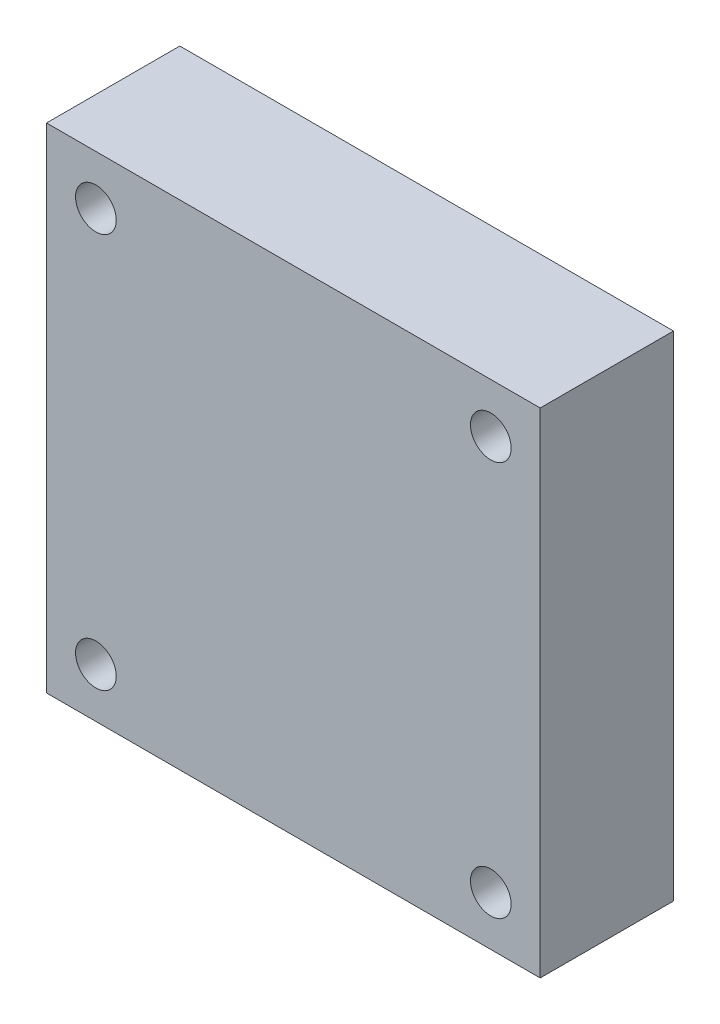
ISO-10303-21;
HEADER;
FILE_DESCRIPTION(('STEP AP214'),'2;1');
FILE_NAME('part.step','',(''),(''),'','','');
FILE_SCHEMA(('AUTOMOTIVE_DESIGN { 1 0 10303 214 1 1 1 1 }'));
ENDSEC;
DATA;
#1=APPLICATION_CONTEXT('core data for automotive mechanical design processes');
#2=APPLICATION_PROTOCOL_DEFINITION('international standard','automotive_design',2000,#1);
#3=PRODUCT_CONTEXT('',#1,'mechanical');
#4=PRODUCT('Part','Part','',(#3));
#5=PRODUCT_RELATED_PRODUCT_CATEGORY('part','',(#4));
#6=PRODUCT_DEFINITION_FORMATION('','',#4);
#7=PRODUCT_DEFINITION_CONTEXT('part definition',#1,'design');
#8=PRODUCT_DEFINITION('design','',#6,#7);
#9=PRODUCT_DEFINITION_SHAPE('','',#8);
#10=(LENGTH_UNIT() NAMED_UNIT(*) SI_UNIT(.MILLI.,.METRE.));
#11=(NAMED_UNIT(*) PLANE_ANGLE_UNIT() SI_UNIT($,.RADIAN.));
#12=(NAMED_UNIT(*) SI_UNIT($,.STERADIAN.) SOLID_ANGLE_UNIT());
#13=UNCERTAINTY_MEASURE_WITH_UNIT(LENGTH_MEASURE(1.E-05),#10,'distance_accuracy_value','');
#14=(GEOMETRIC_REPRESENTATION_CONTEXT(3) GLOBAL_UNCERTAINTY_ASSIGNED_CONTEXT((#13)) GLOBAL_UNIT_ASSIGNED_CONTEXT((#10,
#11,#12)) REPRESENTATION_CONTEXT('',''));
#15=CARTESIAN_POINT('',(0.,0.,0.));
#16=DIRECTION('',(0.,0.,1.));
#17=DIRECTION('',(1.,0.,0.));
#18=AXIS2_PLACEMENT_3D('',#15,#16,#17);
#19=CARTESIAN_POINT('',(0.,0.,10.8));
#20=DIRECTION('',(1.,0.,0.));
#21=DIRECTION('',(0.,0.,-1.));
#22=AXIS2_PLACEMENT_3D('',#19,#20,#21);
#23=PLANE('',#22);
#24=DIRECTION('',(0.,-1.,0.));
#25=VECTOR('',#24,1.);
#26=CARTESIAN_POINT('',(0.,0.,0.));
#27=LINE('',#26,#25);
#28=CARTESIAN_POINT('',(0.,40.,0.));
#29=VERTEX_POINT('',#28);
#30=CARTESIAN_POINT('',(0.,0.,0.));
#31=VERTEX_POINT('',#30);
#32=EDGE_CURVE('E107',#29,#31,#27,.T.);
#33=ORIENTED_EDGE('',*,*,#32,.T.);
#34=DIRECTION('',(0.,0.,-1.));
#35=VECTOR('',#34,1.);
#36=CARTESIAN_POINT('',(0.,0.,10.8));
#37=LINE('',#36,#35);
#38=CARTESIAN_POINT('',(0.,0.,10.8));
#39=VERTEX_POINT('',#38);
#40=EDGE_CURVE('E11',#39,#31,#37,.T.);
#41=ORIENTED_EDGE('',*,*,#40,.F.);
#42=DIRECTION('',(0.,-1.,0.));
#43=VECTOR('',#42,1.);
#44=CARTESIAN_POINT('',(0.,0.,10.8));
#45=LINE('',#44,#43);
#46=CARTESIAN_POINT('',(0.,40.,10.8));
#47=VERTEX_POINT('',#46);
#48=EDGE_CURVE('E91',#47,#39,#45,.T.);
#49=ORIENTED_EDGE('',*,*,#48,.F.);
#50=DIRECTION('',(0.,0.,-1.));
#51=VECTOR('',#50,1.);
#52=CARTESIAN_POINT('',(0.,40.,10.8));
#53=LINE('',#52,#51);
#54=EDGE_CURVE('E103',#47,#29,#53,.T.);
#55=ORIENTED_EDGE('',*,*,#54,.T.);
#56=EDGE_LOOP('',(#33,#41,#49,#55));
#57=FACE_BOUND('',#56,.T.);
#58=ADVANCED_FACE('F39',(#57),#23,.F.);
#59=CARTESIAN_POINT('',(0.,0.,10.8));
#60=DIRECTION('',(0.,1.,0.));
#61=DIRECTION('',(0.,0.,1.));
#62=AXIS2_PLACEMENT_3D('',#59,#60,#61);
#63=PLANE('',#62);
#64=DIRECTION('',(1.,0.,0.));
#65=VECTOR('',#64,1.);
#66=CARTESIAN_POINT('',(0.,0.,0.));
#67=LINE('',#66,#65);
#68=CARTESIAN_POINT('',(40.,0.,0.));
#69=VERTEX_POINT('',#68);
#70=EDGE_CURVE('E96',#31,#69,#67,.T.);
#71=ORIENTED_EDGE('',*,*,#70,.T.);
#72=DIRECTION('',(0.,0.,-1.));
#73=VECTOR('',#72,1.);
#74=CARTESIAN_POINT('',(40.,0.,10.8));
#75=LINE('',#74,#73);
#76=CARTESIAN_POINT('',(40.,0.,10.8));
#77=VERTEX_POINT('',#76);
#78=EDGE_CURVE('E48',#77,#69,#75,.T.);
#79=ORIENTED_EDGE('',*,*,#78,.F.);
#80=DIRECTION('',(1.,0.,0.));
#81=VECTOR('',#80,1.);
#82=CARTESIAN_POINT('',(0.,0.,10.8));
#83=LINE('',#82,#81);
#84=EDGE_CURVE('E86',#39,#77,#83,.T.);
#85=ORIENTED_EDGE('',*,*,#84,.F.);
#86=ORIENTED_EDGE('',*,*,#40,.T.);
#87=EDGE_LOOP('',(#71,#79,#85,#86));
#88=FACE_BOUND('',#87,.T.);
#89=ADVANCED_FACE('F95',(#88),#63,.F.);
#90=CARTESIAN_POINT('',(40.,0.,10.8));
#91=DIRECTION('',(-1.,0.,0.));
#92=DIRECTION('',(0.,0.,1.));
#93=AXIS2_PLACEMENT_3D('',#90,#91,#92);
#94=PLANE('',#93);
#95=DIRECTION('',(0.,1.,0.));
#96=VECTOR('',#95,1.);
#97=CARTESIAN_POINT('',(40.,0.,0.));
#98=LINE('',#97,#96);
#99=CARTESIAN_POINT('',(40.,40.,0.));
#100=VERTEX_POINT('',#99);
#101=EDGE_CURVE('E73',#69,#100,#98,.T.);
#102=ORIENTED_EDGE('',*,*,#101,.T.);
#103=DIRECTION('',(0.,0.,-1.));
#104=VECTOR('',#103,1.);
#105=CARTESIAN_POINT('',(40.,40.,10.8));
#106=LINE('',#105,#104);
#107=CARTESIAN_POINT('',(40.,40.,10.8));
#108=VERTEX_POINT('',#107);
#109=EDGE_CURVE('E98',#108,#100,#106,.T.);
#110=ORIENTED_EDGE('',*,*,#109,.F.);
#111=DIRECTION('',(0.,1.,0.));
#112=VECTOR('',#111,1.);
#113=CARTESIAN_POINT('',(40.,0.,10.8));
#114=LINE('',#113,#112);
#115=EDGE_CURVE('E89',#77,#108,#114,.T.);
#116=ORIENTED_EDGE('',*,*,#115,.F.);
#117=ORIENTED_EDGE('',*,*,#78,.T.);
#118=EDGE_LOOP('',(#102,#110,#116,#117));
#119=FACE_BOUND('',#118,.T.);
#120=ADVANCED_FACE('F99',(#119),#94,.F.);
#121=CARTESIAN_POINT('',(0.,40.,10.8));
#122=DIRECTION('',(0.,-1.,0.));
#123=DIRECTION('',(0.,0.,-1.));
#124=AXIS2_PLACEMENT_3D('',#121,#122,#123);
#125=PLANE('',#124);
#126=DIRECTION('',(-1.,0.,0.));
#127=VECTOR('',#126,1.);
#128=CARTESIAN_POINT('',(0.,40.,0.));
#129=LINE('',#128,#127);
#130=EDGE_CURVE('E79',#100,#29,#129,.T.);
#131=ORIENTED_EDGE('',*,*,#130,.T.);
#132=ORIENTED_EDGE('',*,*,#54,.F.);
#133=DIRECTION('',(-1.,0.,0.));
#134=VECTOR('',#133,1.);
#135=CARTESIAN_POINT('',(0.,40.,10.8));
#136=LINE('',#135,#134);
#137=EDGE_CURVE('E56',#108,#47,#136,.T.);
#138=ORIENTED_EDGE('',*,*,#137,.F.);
#139=ORIENTED_EDGE('',*,*,#109,.T.);
#140=EDGE_LOOP('',(#131,#132,#138,#139));
#141=FACE_BOUND('',#140,.T.);
#142=ADVANCED_FACE('F121',(#141),#125,.F.);
#143=CARTESIAN_POINT('',(0.,0.,10.8));
#144=DIRECTION('',(0.,0.,-1.));
#145=DIRECTION('',(-1.,0.,0.));
#146=AXIS2_PLACEMENT_3D('',#143,#144,#145);
#147=PLANE('',#146);
#148=CARTESIAN_POINT('',(36.,36.,10.8));
#149=DIRECTION('',(0.,0.,1.));
#150=DIRECTION('',(1.,0.,0.));
#151=AXIS2_PLACEMENT_3D('',#148,#149,#150);
#152=CIRCLE('',#151,1.65);
#153=CARTESIAN_POINT('',(37.65,36.,10.8));
#154=VERTEX_POINT('',#153);
#155=EDGE_CURVE('E145',#154,#154,#152,.T.);
#156=ORIENTED_EDGE('',*,*,#155,.F.);
#157=EDGE_LOOP('',(#156));
#158=FACE_BOUND('',#157,.T.);
#159=CARTESIAN_POINT('',(4.,4.00000000000001,10.8));
#160=DIRECTION('',(0.,0.,1.));
#161=DIRECTION('',(1.,0.,0.));
#162=AXIS2_PLACEMENT_3D('',#159,#160,#161);
#163=CIRCLE('',#162,1.65);
#164=CARTESIAN_POINT('',(5.65,4.00000000000001,10.8));
#165=VERTEX_POINT('',#164);
#166=EDGE_CURVE('E136',#165,#165,#163,.T.);
#167=ORIENTED_EDGE('',*,*,#166,.F.);
#168=EDGE_LOOP('',(#167));
#169=FACE_BOUND('',#168,.T.);
#170=CARTESIAN_POINT('',(36.,4.,10.8));
#171=DIRECTION('',(0.,0.,1.));
#172=DIRECTION('',(1.,0.,0.));
#173=AXIS2_PLACEMENT_3D('',#170,#171,#172);
#174=CIRCLE('',#173,1.65);
#175=CARTESIAN_POINT('',(37.65,4.,10.8));
#176=VERTEX_POINT('',#175);
#177=EDGE_CURVE('E152',#176,#176,#174,.T.);
#178=ORIENTED_EDGE('',*,*,#177,.F.);
#179=EDGE_LOOP('',(#178));
#180=FACE_BOUND('',#179,.T.);
#181=CARTESIAN_POINT('',(4.,36.,10.8));
#182=DIRECTION('',(0.,0.,1.));
#183=DIRECTION('',(1.,0.,0.));
#184=AXIS2_PLACEMENT_3D('',#181,#182,#183);
#185=CIRCLE('',#184,1.65);
#186=CARTESIAN_POINT('',(5.65,36.,10.8));
#187=VERTEX_POINT('',#186);
#188=EDGE_CURVE('E128',#187,#187,#185,.T.);
#189=ORIENTED_EDGE('',*,*,#188,.F.);
#190=EDGE_LOOP('',(#189));
#191=FACE_BOUND('',#190,.T.);
#192=ORIENTED_EDGE('',*,*,#48,.T.);
#193=ORIENTED_EDGE('',*,*,#84,.T.);
#194=ORIENTED_EDGE('',*,*,#115,.T.);
#195=ORIENTED_EDGE('',*,*,#137,.T.);
#196=EDGE_LOOP('',(#192,#193,#194,#195));
#197=FACE_BOUND('',#196,.T.);
#198=ADVANCED_FACE('F87',(#158,#169,#180,#191,#197),#147,.F.);
#199=CARTESIAN_POINT('',(0.,0.,0.));
#200=DIRECTION('',(0.,0.,-1.));
#201=DIRECTION('',(-1.,0.,0.));
#202=AXIS2_PLACEMENT_3D('',#199,#200,#201);
#203=PLANE('',#202);
#204=CARTESIAN_POINT('',(36.,36.,0.));
#205=DIRECTION('',(0.,0.,1.));
#206=DIRECTION('',(1.,0.,0.));
#207=AXIS2_PLACEMENT_3D('',#204,#205,#206);
#208=CIRCLE('',#207,1.65);
#209=CARTESIAN_POINT('',(37.65,36.,0.));
#210=VERTEX_POINT('',#209);
#211=EDGE_CURVE('E132',#210,#210,#208,.T.);
#212=ORIENTED_EDGE('',*,*,#211,.T.);
#213=EDGE_LOOP('',(#212));
#214=FACE_BOUND('',#213,.T.);
#215=CARTESIAN_POINT('',(4.,4.00000000000001,0.));
#216=DIRECTION('',(0.,0.,1.));
#217=DIRECTION('',(1.,0.,0.));
#218=AXIS2_PLACEMENT_3D('',#215,#216,#217);
#219=CIRCLE('',#218,1.65);
#220=CARTESIAN_POINT('',(5.65,4.00000000000001,0.));
#221=VERTEX_POINT('',#220);
#222=EDGE_CURVE('E140',#221,#221,#219,.T.);
#223=ORIENTED_EDGE('',*,*,#222,.T.);
#224=EDGE_LOOP('',(#223));
#225=FACE_BOUND('',#224,.T.);
#226=CARTESIAN_POINT('',(36.,4.,0.));
#227=DIRECTION('',(0.,0.,1.));
#228=DIRECTION('',(1.,0.,0.));
#229=AXIS2_PLACEMENT_3D('',#226,#227,#228);
#230=CIRCLE('',#229,1.65);
#231=CARTESIAN_POINT('',(37.65,4.,0.));
#232=VERTEX_POINT('',#231);
#233=EDGE_CURVE('E141',#232,#232,#230,.T.);
#234=ORIENTED_EDGE('',*,*,#233,.T.);
#235=EDGE_LOOP('',(#234));
#236=FACE_BOUND('',#235,.T.);
#237=CARTESIAN_POINT('',(4.,36.,0.));
#238=DIRECTION('',(0.,0.,1.));
#239=DIRECTION('',(1.,0.,0.));
#240=AXIS2_PLACEMENT_3D('',#237,#238,#239);
#241=CIRCLE('',#240,1.65);
#242=CARTESIAN_POINT('',(5.65,36.,0.));
#243=VERTEX_POINT('',#242);
#244=EDGE_CURVE('E111',#243,#243,#241,.T.);
#245=ORIENTED_EDGE('',*,*,#244,.T.);
#246=EDGE_LOOP('',(#245));
#247=FACE_BOUND('',#246,.T.);
#248=ORIENTED_EDGE('',*,*,#32,.F.);
#249=ORIENTED_EDGE('',*,*,#130,.F.);
#250=ORIENTED_EDGE('',*,*,#101,.F.);
#251=ORIENTED_EDGE('',*,*,#70,.F.);
#252=EDGE_LOOP('',(#248,#249,#250,#251));
#253=FACE_BOUND('',#252,.T.);
#254=ADVANCED_FACE('F124',(#214,#225,#236,#247,#253),#203,.T.);
#255=CARTESIAN_POINT('',(4.,36.,0.));
#256=DIRECTION('',(0.,0.,1.));
#257=DIRECTION('',(1.,0.,0.));
#258=AXIS2_PLACEMENT_3D('',#255,#256,#257);
#259=CYLINDRICAL_SURFACE('',#258,1.65);
#260=CARTESIAN_POINT('',(5.65,36.,0.));
#261=CARTESIAN_POINT('',(5.65,36.,0.1125));
#262=CARTESIAN_POINT('',(5.65,36.,0.225));
#263=CARTESIAN_POINT('',(5.65,36.,0.45));
#264=CARTESIAN_POINT('',(5.65,36.,0.5625));
#265=CARTESIAN_POINT('',(5.65,36.,0.7875));
#266=CARTESIAN_POINT('',(5.65,36.,0.9));
#267=CARTESIAN_POINT('',(5.65,36.,1.125));
#268=CARTESIAN_POINT('',(5.65,36.,1.2375));
#269=CARTESIAN_POINT('',(5.65,36.,1.4625));
#270=CARTESIAN_POINT('',(5.65,36.,1.575));
#271=CARTESIAN_POINT('',(5.65,36.,1.8));
#272=CARTESIAN_POINT('',(5.65,36.,1.9125));
#273=CARTESIAN_POINT('',(5.65,36.,2.1375));
#274=CARTESIAN_POINT('',(5.65,36.,2.25));
#275=CARTESIAN_POINT('',(5.65,36.,2.475));
#276=CARTESIAN_POINT('',(5.65,36.,2.5875));
#277=CARTESIAN_POINT('',(5.65,36.,2.8125));
#278=CARTESIAN_POINT('',(5.65,36.,2.925));
#279=CARTESIAN_POINT('',(5.65,36.,3.15));
#280=CARTESIAN_POINT('',(5.65,36.,3.2625));
#281=CARTESIAN_POINT('',(5.65,36.,3.4875));
#282=CARTESIAN_POINT('',(5.65,36.,3.6));
#283=CARTESIAN_POINT('',(5.65,36.,3.825));
#284=CARTESIAN_POINT('',(5.65,36.,3.9375));
#285=CARTESIAN_POINT('',(5.65,36.,4.1625));
#286=CARTESIAN_POINT('',(5.65,36.,4.275));
#287=CARTESIAN_POINT('',(5.65,36.,4.5));
#288=CARTESIAN_POINT('',(5.65,36.,4.6125));
#289=CARTESIAN_POINT('',(5.65,36.,4.8375));
#290=CARTESIAN_POINT('',(5.65,36.,4.95));
#291=CARTESIAN_POINT('',(5.65,36.,5.175));
#292=CARTESIAN_POINT('',(5.65,36.,5.2875));
#293=CARTESIAN_POINT('',(5.65,36.,5.5125));
#294=CARTESIAN_POINT('',(5.65,36.,5.625));
#295=CARTESIAN_POINT('',(5.65,36.,5.85));
#296=CARTESIAN_POINT('',(5.65,36.,5.9625));
#297=CARTESIAN_POINT('',(5.65,36.,6.1875));
#298=CARTESIAN_POINT('',(5.65,36.,6.3));
#299=CARTESIAN_POINT('',(5.65,36.,6.525));
#300=CARTESIAN_POINT('',(5.65,36.,6.6375));
#301=CARTESIAN_POINT('',(5.65,36.,6.8625));
#302=CARTESIAN_POINT('',(5.65,36.,6.975));
#303=CARTESIAN_POINT('',(5.65,36.,7.2));
#304=CARTESIAN_POINT('',(5.65,36.,7.3125));
#305=CARTESIAN_POINT('',(5.65,36.,7.5375));
#306=CARTESIAN_POINT('',(5.65,36.,7.65));
#307=CARTESIAN_POINT('',(5.65,36.,7.875));
#308=CARTESIAN_POINT('',(5.65,36.,7.9875));
#309=CARTESIAN_POINT('',(5.65,36.,8.2125));
#310=CARTESIAN_POINT('',(5.65,36.,8.325));
#311=CARTESIAN_POINT('',(5.65,36.,8.55));
#312=CARTESIAN_POINT('',(5.65,36.,8.6625));
#313=CARTESIAN_POINT('',(5.65,36.,8.8875));
#314=CARTESIAN_POINT('',(5.65,36.,9.));
#315=CARTESIAN_POINT('',(5.65,36.,9.225));
#316=CARTESIAN_POINT('',(5.65,36.,9.3375));
#317=CARTESIAN_POINT('',(5.65,36.,9.5625));
#318=CARTESIAN_POINT('',(5.65,36.,9.675));
#319=CARTESIAN_POINT('',(5.65,36.,9.9));
#320=CARTESIAN_POINT('',(5.65,36.,10.0125));
#321=CARTESIAN_POINT('',(5.65,36.,10.2375));
#322=CARTESIAN_POINT('',(5.65,36.,10.35));
#323=CARTESIAN_POINT('',(5.65,36.,10.575));
#324=CARTESIAN_POINT('',(5.65,36.,10.6875));
#325=CARTESIAN_POINT('',(5.65,36.,10.8));
#326=B_SPLINE_CURVE_WITH_KNOTS('',3,(#260,#261,#262,#263,#264,#265,#266,#267,#268,#269,#270,
#271,#272,#273,#274,#275,#276,#277,#278,#279,#280,#281,#282,#283,#284,#285,#286,#287,#288,#289,
#290,#291,#292,#293,#294,#295,#296,#297,#298,#299,#300,#301,#302,#303,#304,#305,#306,#307,#308,
#309,#310,#311,#312,#313,#314,#315,#316,#317,#318,#319,#320,#321,#322,#323,#324,#325),
.UNSPECIFIED.,.F.,.F.,(4,2,2,2,2,2,2,2,2,2,2,2,2,2,2,2,2,2,2,2,2,2,2,2,2,2,2,2,2,2,2,2,4),(0.,
0.3375,0.675,1.0125,1.35,1.6875,2.025,2.3625,2.7,3.0375,3.375,3.7125,4.05,4.3875,4.725,5.0625,
5.4,5.7375,6.075,6.4125,6.75,7.0875,7.425,7.7625,8.1,8.4375,8.775,9.1125,9.45,9.7875,10.125,
10.4625,10.8),.UNSPECIFIED.);
#327=EDGE_CURVE('BSEAM166',#243,#187,#326,.T.);
#328=ORIENTED_EDGE('',*,*,#244,.F.);
#329=ORIENTED_EDGE('',*,*,#188,.T.);
#330=ORIENTED_EDGE('',*,*,#327,.T.);
#331=ORIENTED_EDGE('',*,*,#327,.F.);
#332=EDGE_LOOP('',(#328,#330,#329,#331));
#333=FACE_BOUND('',#332,.T.);
#334=ADVANCED_FACE('F166',(#333),#259,.F.);
#335=CARTESIAN_POINT('',(36.,4.,0.));
#336=DIRECTION('',(0.,0.,1.));
#337=DIRECTION('',(1.,0.,0.));
#338=AXIS2_PLACEMENT_3D('',#335,#336,#337);
#339=CYLINDRICAL_SURFACE('',#338,1.65);
#340=CARTESIAN_POINT('',(37.65,4.,0.));
#341=CARTESIAN_POINT('',(37.65,4.,0.1125));
#342=CARTESIAN_POINT('',(37.65,4.,0.225));
#343=CARTESIAN_POINT('',(37.65,4.,0.45));
#344=CARTESIAN_POINT('',(37.65,4.,0.5625));
#345=CARTESIAN_POINT('',(37.65,4.,0.7875));
#346=CARTESIAN_POINT('',(37.65,4.,0.9));
#347=CARTESIAN_POINT('',(37.65,4.,1.125));
#348=CARTESIAN_POINT('',(37.65,4.,1.2375));
#349=CARTESIAN_POINT('',(37.65,4.,1.4625));
#350=CARTESIAN_POINT('',(37.65,4.,1.575));
#351=CARTESIAN_POINT('',(37.65,4.,1.8));
#352=CARTESIAN_POINT('',(37.65,4.,1.9125));
#353=CARTESIAN_POINT('',(37.65,4.,2.1375));
#354=CARTESIAN_POINT('',(37.65,4.,2.25));
#355=CARTESIAN_POINT('',(37.65,4.,2.475));
#356=CARTESIAN_POINT('',(37.65,4.,2.5875));
#357=CARTESIAN_POINT('',(37.65,4.,2.8125));
#358=CARTESIAN_POINT('',(37.65,4.,2.925));
#359=CARTESIAN_POINT('',(37.65,4.,3.15));
#360=CARTESIAN_POINT('',(37.65,4.,3.2625));
#361=CARTESIAN_POINT('',(37.65,4.,3.4875));
#362=CARTESIAN_POINT('',(37.65,4.,3.6));
#363=CARTESIAN_POINT('',(37.65,4.,3.825));
#364=CARTESIAN_POINT('',(37.65,4.,3.9375));
#365=CARTESIAN_POINT('',(37.65,4.,4.1625));
#366=CARTESIAN_POINT('',(37.65,4.,4.275));
#367=CARTESIAN_POINT('',(37.65,4.,4.5));
#368=CARTESIAN_POINT('',(37.65,4.,4.6125));
#369=CARTESIAN_POINT('',(37.65,4.,4.8375));
#370=CARTESIAN_POINT('',(37.65,4.,4.95));
#371=CARTESIAN_POINT('',(37.65,4.,5.175));
#372=CARTESIAN_POINT('',(37.65,4.,5.2875));
#373=CARTESIAN_POINT('',(37.65,4.,5.5125));
#374=CARTESIAN_POINT('',(37.65,4.,5.625));
#375=CARTESIAN_POINT('',(37.65,4.,5.85));
#376=CARTESIAN_POINT('',(37.65,4.,5.9625));
#377=CARTESIAN_POINT('',(37.65,4.,6.1875));
#378=CARTESIAN_POINT('',(37.65,4.,6.3));
#379=CARTESIAN_POINT('',(37.65,4.,6.525));
#380=CARTESIAN_POINT('',(37.65,4.,6.6375));
#381=CARTESIAN_POINT('',(37.65,4.,6.8625));
#382=CARTESIAN_POINT('',(37.65,4.,6.975));
#383=CARTESIAN_POINT('',(37.65,4.,7.2));
#384=CARTESIAN_POINT('',(37.65,4.,7.3125));
#385=CARTESIAN_POINT('',(37.65,4.,7.5375));
#386=CARTESIAN_POINT('',(37.65,4.,7.65));
#387=CARTESIAN_POINT('',(37.65,4.,7.875));
#388=CARTESIAN_POINT('',(37.65,4.,7.9875));
#389=CARTESIAN_POINT('',(37.65,4.,8.2125));
#390=CARTESIAN_POINT('',(37.65,4.,8.325));
#391=CARTESIAN_POINT('',(37.65,4.,8.55));
#392=CARTESIAN_POINT('',(37.65,4.,8.6625));
#393=CARTESIAN_POINT('',(37.65,4.,8.8875));
#394=CARTESIAN_POINT('',(37.65,4.,9.));
#395=CARTESIAN_POINT('',(37.65,4.,9.225));
#396=CARTESIAN_POINT('',(37.65,4.,9.3375));
#397=CARTESIAN_POINT('',(37.65,4.,9.5625));
#398=CARTESIAN_POINT('',(37.65,4.,9.675));
#399=CARTESIAN_POINT('',(37.65,4.,9.9));
#400=CARTESIAN_POINT('',(37.65,4.,10.0125));
#401=CARTESIAN_POINT('',(37.65,4.,10.2375));
#402=CARTESIAN_POINT('',(37.65,4.,10.35));
#403=CARTESIAN_POINT('',(37.65,4.,10.575));
#404=CARTESIAN_POINT('',(37.65,4.,10.6875));
#405=CARTESIAN_POINT('',(37.65,4.,10.8));
#406=B_SPLINE_CURVE_WITH_KNOTS('',3,(#340,#341,#342,#343,#344,#345,#346,#347,#348,#349,#350,
#351,#352,#353,#354,#355,#356,#357,#358,#359,#360,#361,#362,#363,#364,#365,#366,#367,#368,#369,
#370,#371,#372,#373,#374,#375,#376,#377,#378,#379,#380,#381,#382,#383,#384,#385,#386,#387,#388,
#389,#390,#391,#392,#393,#394,#395,#396,#397,#398,#399,#400,#401,#402,#403,#404,#405),
.UNSPECIFIED.,.F.,.F.,(4,2,2,2,2,2,2,2,2,2,2,2,2,2,2,2,2,2,2,2,2,2,2,2,2,2,2,2,2,2,2,2,4),(0.,
0.3375,0.675,1.0125,1.35,1.6875,2.025,2.3625,2.7,3.0375,3.375,3.7125,4.05,4.3875,4.725,5.0625,
5.4,5.7375,6.075,6.4125,6.75,7.0875,7.425,7.7625,8.1,8.4375,8.775,9.1125,9.45,9.7875,10.125,
10.4625,10.8),.UNSPECIFIED.);
#407=EDGE_CURVE('BSEAM162',#232,#176,#406,.T.);
#408=ORIENTED_EDGE('',*,*,#233,.F.);
#409=ORIENTED_EDGE('',*,*,#177,.T.);
#410=ORIENTED_EDGE('',*,*,#407,.T.);
#411=ORIENTED_EDGE('',*,*,#407,.F.);
#412=EDGE_LOOP('',(#408,#410,#409,#411));
#413=FACE_BOUND('',#412,.T.);
#414=ADVANCED_FACE('F162',(#413),#339,.F.);
#415=CARTESIAN_POINT('',(4.,4.00000000000001,0.));
#416=DIRECTION('',(0.,0.,1.));
#417=DIRECTION('',(1.,0.,0.));
#418=AXIS2_PLACEMENT_3D('',#415,#416,#417);
#419=CYLINDRICAL_SURFACE('',#418,1.65);
#420=CARTESIAN_POINT('',(5.65,4.00000000000001,0.));
#421=CARTESIAN_POINT('',(5.65,4.00000000000001,0.1125));
#422=CARTESIAN_POINT('',(5.65,4.00000000000001,0.225));
#423=CARTESIAN_POINT('',(5.65,4.00000000000001,0.45));
#424=CARTESIAN_POINT('',(5.65,4.00000000000001,0.5625));
#425=CARTESIAN_POINT('',(5.65,4.00000000000001,0.7875));
#426=CARTESIAN_POINT('',(5.65,4.00000000000001,0.9));
#427=CARTESIAN_POINT('',(5.65,4.00000000000001,1.125));
#428=CARTESIAN_POINT('',(5.65,4.00000000000001,1.2375));
#429=CARTESIAN_POINT('',(5.65,4.00000000000001,1.4625));
#430=CARTESIAN_POINT('',(5.65,4.00000000000001,1.575));
#431=CARTESIAN_POINT('',(5.65,4.00000000000001,1.8));
#432=CARTESIAN_POINT('',(5.65,4.00000000000001,1.9125));
#433=CARTESIAN_POINT('',(5.65,4.00000000000001,2.1375));
#434=CARTESIAN_POINT('',(5.65,4.00000000000001,2.25));
#435=CARTESIAN_POINT('',(5.65,4.00000000000001,2.475));
#436=CARTESIAN_POINT('',(5.65,4.00000000000001,2.5875));
#437=CARTESIAN_POINT('',(5.65,4.00000000000001,2.8125));
#438=CARTESIAN_POINT('',(5.65,4.00000000000001,2.925));
#439=CARTESIAN_POINT('',(5.65,4.00000000000001,3.15));
#440=CARTESIAN_POINT('',(5.65,4.00000000000001,3.2625));
#441=CARTESIAN_POINT('',(5.65,4.00000000000001,3.4875));
#442=CARTESIAN_POINT('',(5.65,4.00000000000001,3.6));
#443=CARTESIAN_POINT('',(5.65,4.00000000000001,3.825));
#444=CARTESIAN_POINT('',(5.65,4.00000000000001,3.9375));
#445=CARTESIAN_POINT('',(5.65,4.00000000000001,4.1625));
#446=CARTESIAN_POINT('',(5.65,4.00000000000001,4.275));
#447=CARTESIAN_POINT('',(5.65,4.00000000000001,4.5));
#448=CARTESIAN_POINT('',(5.65,4.00000000000001,4.6125));
#449=CARTESIAN_POINT('',(5.65,4.00000000000001,4.8375));
#450=CARTESIAN_POINT('',(5.65,4.00000000000001,4.95));
#451=CARTESIAN_POINT('',(5.65,4.00000000000001,5.175));
#452=CARTESIAN_POINT('',(5.65,4.00000000000001,5.2875));
#453=CARTESIAN_POINT('',(5.65,4.00000000000001,5.5125));
#454=CARTESIAN_POINT('',(5.65,4.00000000000001,5.625));
#455=CARTESIAN_POINT('',(5.65,4.00000000000001,5.85));
#456=CARTESIAN_POINT('',(5.65,4.00000000000001,5.9625));
#457=CARTESIAN_POINT('',(5.65,4.00000000000001,6.1875));
#458=CARTESIAN_POINT('',(5.65,4.00000000000001,6.3));
#459=CARTESIAN_POINT('',(5.65,4.00000000000001,6.525));
#460=CARTESIAN_POINT('',(5.65,4.00000000000001,6.6375));
#461=CARTESIAN_POINT('',(5.65,4.00000000000001,6.8625));
#462=CARTESIAN_POINT('',(5.65,4.00000000000001,6.975));
#463=CARTESIAN_POINT('',(5.65,4.00000000000001,7.2));
#464=CARTESIAN_POINT('',(5.65,4.00000000000001,7.3125));
#465=CARTESIAN_POINT('',(5.65,4.00000000000001,7.5375));
#466=CARTESIAN_POINT('',(5.65,4.00000000000001,7.65));
#467=CARTESIAN_POINT('',(5.65,4.00000000000001,7.875));
#468=CARTESIAN_POINT('',(5.65,4.00000000000001,7.9875));
#469=CARTESIAN_POINT('',(5.65,4.00000000000001,8.2125));
#470=CARTESIAN_POINT('',(5.65,4.00000000000001,8.325));
#471=CARTESIAN_POINT('',(5.65,4.00000000000001,8.55));
#472=CARTESIAN_POINT('',(5.65,4.00000000000001,8.6625));
#473=CARTESIAN_POINT('',(5.65,4.00000000000001,8.8875));
#474=CARTESIAN_POINT('',(5.65,4.00000000000001,9.));
#475=CARTESIAN_POINT('',(5.65,4.00000000000001,9.225));
#476=CARTESIAN_POINT('',(5.65,4.00000000000001,9.3375));
#477=CARTESIAN_POINT('',(5.65,4.00000000000001,9.5625));
#478=CARTESIAN_POINT('',(5.65,4.00000000000001,9.675));
#479=CARTESIAN_POINT('',(5.65,4.00000000000001,9.9));
#480=CARTESIAN_POINT('',(5.65,4.00000000000001,10.0125));
#481=CARTESIAN_POINT('',(5.65,4.00000000000001,10.2375));
#482=CARTESIAN_POINT('',(5.65,4.00000000000001,10.35));
#483=CARTESIAN_POINT('',(5.65,4.00000000000001,10.575));
#484=CARTESIAN_POINT('',(5.65,4.00000000000001,10.6875));
#485=CARTESIAN_POINT('',(5.65,4.00000000000001,10.8));
#486=B_SPLINE_CURVE_WITH_KNOTS('',3,(#420,#421,#422,#423,#424,#425,#426,#427,#428,#429,#430,
#431,#432,#433,#434,#435,#436,#437,#438,#439,#440,#441,#442,#443,#444,#445,#446,#447,#448,#449,
#450,#451,#452,#453,#454,#455,#456,#457,#458,#459,#460,#461,#462,#463,#464,#465,#466,#467,#468,
#469,#470,#471,#472,#473,#474,#475,#476,#477,#478,#479,#480,#481,#482,#483,#484,#485),
.UNSPECIFIED.,.F.,.F.,(4,2,2,2,2,2,2,2,2,2,2,2,2,2,2,2,2,2,2,2,2,2,2,2,2,2,2,2,2,2,2,2,4),(0.,
0.3375,0.675,1.0125,1.35,1.6875,2.025,2.3625,2.7,3.0375,3.375,3.7125,4.05,4.3875,4.725,5.0625,
5.4,5.7375,6.075,6.4125,6.75,7.0875,7.425,7.7625,8.1,8.4375,8.775,9.1125,9.45,9.7875,10.125,
10.4625,10.8),.UNSPECIFIED.);
#487=EDGE_CURVE('BSEAM165',#221,#165,#486,.T.);
#488=ORIENTED_EDGE('',*,*,#222,.F.);
#489=ORIENTED_EDGE('',*,*,#166,.T.);
#490=ORIENTED_EDGE('',*,*,#487,.T.);
#491=ORIENTED_EDGE('',*,*,#487,.F.);
#492=EDGE_LOOP('',(#488,#490,#489,#491));
#493=FACE_BOUND('',#492,.T.);
#494=ADVANCED_FACE('F165',(#493),#419,.F.);
#495=CARTESIAN_POINT('',(36.,36.,0.));
#496=DIRECTION('',(0.,0.,1.));
#497=DIRECTION('',(1.,0.,0.));
#498=AXIS2_PLACEMENT_3D('',#495,#496,#497);
#499=CYLINDRICAL_SURFACE('',#498,1.65);
#500=CARTESIAN_POINT('',(37.65,36.,0.));
#501=CARTESIAN_POINT('',(37.65,36.,0.1125));
#502=CARTESIAN_POINT('',(37.65,36.,0.225));
#503=CARTESIAN_POINT('',(37.65,36.,0.45));
#504=CARTESIAN_POINT('',(37.65,36.,0.5625));
#505=CARTESIAN_POINT('',(37.65,36.,0.7875));
#506=CARTESIAN_POINT('',(37.65,36.,0.9));
#507=CARTESIAN_POINT('',(37.65,36.,1.125));
#508=CARTESIAN_POINT('',(37.65,36.,1.2375));
#509=CARTESIAN_POINT('',(37.65,36.,1.4625));
#510=CARTESIAN_POINT('',(37.65,36.,1.575));
#511=CARTESIAN_POINT('',(37.65,36.,1.8));
#512=CARTESIAN_POINT('',(37.65,36.,1.9125));
#513=CARTESIAN_POINT('',(37.65,36.,2.1375));
#514=CARTESIAN_POINT('',(37.65,36.,2.25));
#515=CARTESIAN_POINT('',(37.65,36.,2.475));
#516=CARTESIAN_POINT('',(37.65,36.,2.5875));
#517=CARTESIAN_POINT('',(37.65,36.,2.8125));
#518=CARTESIAN_POINT('',(37.65,36.,2.925));
#519=CARTESIAN_POINT('',(37.65,36.,3.15));
#520=CARTESIAN_POINT('',(37.65,36.,3.2625));
#521=CARTESIAN_POINT('',(37.65,36.,3.4875));
#522=CARTESIAN_POINT('',(37.65,36.,3.6));
#523=CARTESIAN_POINT('',(37.65,36.,3.825));
#524=CARTESIAN_POINT('',(37.65,36.,3.9375));
#525=CARTESIAN_POINT('',(37.65,36.,4.1625));
#526=CARTESIAN_POINT('',(37.65,36.,4.275));
#527=CARTESIAN_POINT('',(37.65,36.,4.5));
#528=CARTESIAN_POINT('',(37.65,36.,4.6125));
#529=CARTESIAN_POINT('',(37.65,36.,4.8375));
#530=CARTESIAN_POINT('',(37.65,36.,4.95));
#531=CARTESIAN_POINT('',(37.65,36.,5.175));
#532=CARTESIAN_POINT('',(37.65,36.,5.2875));
#533=CARTESIAN_POINT('',(37.65,36.,5.5125));
#534=CARTESIAN_POINT('',(37.65,36.,5.625));
#535=CARTESIAN_POINT('',(37.65,36.,5.85));
#536=CARTESIAN_POINT('',(37.65,36.,5.9625));
#537=CARTESIAN_POINT('',(37.65,36.,6.1875));
#538=CARTESIAN_POINT('',(37.65,36.,6.3));
#539=CARTESIAN_POINT('',(37.65,36.,6.525));
#540=CARTESIAN_POINT('',(37.65,36.,6.6375));
#541=CARTESIAN_POINT('',(37.65,36.,6.8625));
#542=CARTESIAN_POINT('',(37.65,36.,6.975));
#543=CARTESIAN_POINT('',(37.65,36.,7.2));
#544=CARTESIAN_POINT('',(37.65,36.,7.3125));
#545=CARTESIAN_POINT('',(37.65,36.,7.5375));
#546=CARTESIAN_POINT('',(37.65,36.,7.65));
#547=CARTESIAN_POINT('',(37.65,36.,7.875));
#548=CARTESIAN_POINT('',(37.65,36.,7.9875));
#549=CARTESIAN_POINT('',(37.65,36.,8.2125));
#550=CARTESIAN_POINT('',(37.65,36.,8.325));
#551=CARTESIAN_POINT('',(37.65,36.,8.55));
#552=CARTESIAN_POINT('',(37.65,36.,8.6625));
#553=CARTESIAN_POINT('',(37.65,36.,8.8875));
#554=CARTESIAN_POINT('',(37.65,36.,9.));
#555=CARTESIAN_POINT('',(37.65,36.,9.225));
#556=CARTESIAN_POINT('',(37.65,36.,9.3375));
#557=CARTESIAN_POINT('',(37.65,36.,9.5625));
#558=CARTESIAN_POINT('',(37.65,36.,9.675));
#559=CARTESIAN_POINT('',(37.65,36.,9.9));
#560=CARTESIAN_POINT('',(37.65,36.,10.0125));
#561=CARTESIAN_POINT('',(37.65,36.,10.2375));
#562=CARTESIAN_POINT('',(37.65,36.,10.35));
#563=CARTESIAN_POINT('',(37.65,36.,10.575));
#564=CARTESIAN_POINT('',(37.65,36.,10.6875));
#565=CARTESIAN_POINT('',(37.65,36.,10.8));
#566=B_SPLINE_CURVE_WITH_KNOTS('',3,(#500,#501,#502,#503,#504,#505,#506,#507,#508,#509,#510,
#511,#512,#513,#514,#515,#516,#517,#518,#519,#520,#521,#522,#523,#524,#525,#526,#527,#528,#529,
#530,#531,#532,#533,#534,#535,#536,#537,#538,#539,#540,#541,#542,#543,#544,#545,#546,#547,#548,
#549,#550,#551,#552,#553,#554,#555,#556,#557,#558,#559,#560,#561,#562,#563,#564,#565),
.UNSPECIFIED.,.F.,.F.,(4,2,2,2,2,2,2,2,2,2,2,2,2,2,2,2,2,2,2,2,2,2,2,2,2,2,2,2,2,2,2,2,4),(0.,
0.3375,0.675,1.0125,1.35,1.6875,2.025,2.3625,2.7,3.0375,3.375,3.7125,4.05,4.3875,4.725,5.0625,
5.4,5.7375,6.075,6.4125,6.75,7.0875,7.425,7.7625,8.1,8.4375,8.775,9.1125,9.45,9.7875,10.125,
10.4625,10.8),.UNSPECIFIED.);
#567=EDGE_CURVE('BSEAM227',#210,#154,#566,.T.);
#568=ORIENTED_EDGE('',*,*,#211,.F.);
#569=ORIENTED_EDGE('',*,*,#155,.T.);
#570=ORIENTED_EDGE('',*,*,#567,.T.);
#571=ORIENTED_EDGE('',*,*,#567,.F.);
#572=EDGE_LOOP('',(#568,#570,#569,#571));
#573=FACE_BOUND('',#572,.T.);
#574=ADVANCED_FACE('F227',(#573),#499,.F.);
#575=CLOSED_SHELL('',(#58,#89,#120,#142,#198,#254,#334,#414,#494,#574));
#576=MANIFOLD_SOLID_BREP('B2',#575);
#577=ADVANCED_BREP_SHAPE_REPRESENTATION('',(#18,#576),#14);
#578=SHAPE_DEFINITION_REPRESENTATION(#9,#577);
ENDSEC;
END-ISO-10303-21;
